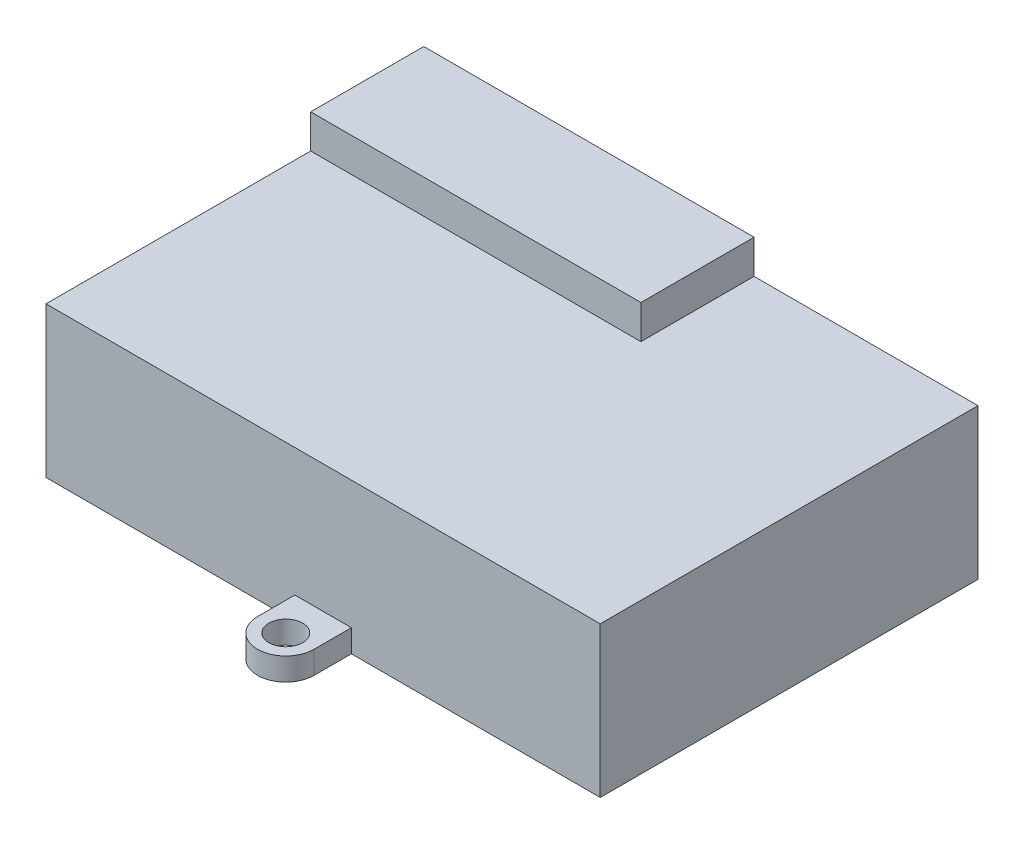
ISO-10303-21;
HEADER;
FILE_DESCRIPTION(('STEP AP214'),'2;1');
FILE_NAME('part.step','',(''),(''),'','','');
FILE_SCHEMA(('AUTOMOTIVE_DESIGN { 1 0 10303 214 1 1 1 1 }'));
ENDSEC;
DATA;
#1=APPLICATION_CONTEXT('core data for automotive mechanical design processes');
#2=APPLICATION_PROTOCOL_DEFINITION('international standard','automotive_design',2000,#1);
#3=PRODUCT_CONTEXT('',#1,'mechanical');
#4=PRODUCT('Part','Part','',(#3));
#5=PRODUCT_RELATED_PRODUCT_CATEGORY('part','',(#4));
#6=PRODUCT_DEFINITION_FORMATION('','',#4);
#7=PRODUCT_DEFINITION_CONTEXT('part definition',#1,'design');
#8=PRODUCT_DEFINITION('design','',#6,#7);
#9=PRODUCT_DEFINITION_SHAPE('','',#8);
#10=(LENGTH_UNIT() NAMED_UNIT(*) SI_UNIT(.MILLI.,.METRE.));
#11=(NAMED_UNIT(*) PLANE_ANGLE_UNIT() SI_UNIT($,.RADIAN.));
#12=(NAMED_UNIT(*) SI_UNIT($,.STERADIAN.) SOLID_ANGLE_UNIT());
#13=UNCERTAINTY_MEASURE_WITH_UNIT(LENGTH_MEASURE(1.E-05),#10,'distance_accuracy_value','');
#14=(GEOMETRIC_REPRESENTATION_CONTEXT(3) GLOBAL_UNCERTAINTY_ASSIGNED_CONTEXT((#13)) GLOBAL_UNIT_ASSIGNED_CONTEXT((#10,
#11,#12)) REPRESENTATION_CONTEXT('',''));
#15=CARTESIAN_POINT('',(0.,0.,0.));
#16=DIRECTION('',(0.,0.,1.));
#17=DIRECTION('',(1.,0.,0.));
#18=AXIS2_PLACEMENT_3D('',#15,#16,#17);
#19=CARTESIAN_POINT('',(0.,13.3,0.));
#20=DIRECTION('',(0.,1.,0.));
#21=DIRECTION('',(0.,0.,1.));
#22=AXIS2_PLACEMENT_3D('',#19,#20,#21);
#23=PLANE('',#22);
#24=DIRECTION('',(0.,0.,1.));
#25=VECTOR('',#24,1.);
#26=CARTESIAN_POINT('',(4.7,13.3,0.));
#27=LINE('',#26,#25);
#28=CARTESIAN_POINT('',(4.7,13.3,-16.7));
#29=VERTEX_POINT('',#28);
#30=CARTESIAN_POINT('',(4.7,13.3,-6.7));
#31=VERTEX_POINT('',#30);
#32=EDGE_CURVE('E180',#29,#31,#27,.T.);
#33=ORIENTED_EDGE('',*,*,#32,.T.);
#34=DIRECTION('',(-1.,0.,0.));
#35=VECTOR('',#34,1.);
#36=CARTESIAN_POINT('',(0.,13.3,-6.7));
#37=LINE('',#36,#35);
#38=CARTESIAN_POINT('',(-24.5,13.3,-6.7));
#39=VERTEX_POINT('',#38);
#40=EDGE_CURVE('E185',#31,#39,#37,.T.);
#41=ORIENTED_EDGE('',*,*,#40,.T.);
#42=DIRECTION('',(0.,0.,1.));
#43=VECTOR('',#42,1.);
#44=CARTESIAN_POINT('',(-24.5,13.3,0.));
#45=LINE('',#44,#43);
#46=CARTESIAN_POINT('',(-24.5,13.3,16.7));
#47=VERTEX_POINT('',#46);
#48=EDGE_CURVE('E178',#39,#47,#45,.T.);
#49=ORIENTED_EDGE('',*,*,#48,.T.);
#50=DIRECTION('',(1.,0.,0.));
#51=VECTOR('',#50,1.);
#52=CARTESIAN_POINT('',(0.,13.3,16.7));
#53=LINE('',#52,#51);
#54=CARTESIAN_POINT('',(24.5,13.3,16.7));
#55=VERTEX_POINT('',#54);
#56=EDGE_CURVE('E284',#47,#55,#53,.T.);
#57=ORIENTED_EDGE('',*,*,#56,.T.);
#58=DIRECTION('',(0.,0.,1.));
#59=VECTOR('',#58,1.);
#60=CARTESIAN_POINT('',(24.5,13.3,0.));
#61=LINE('',#60,#59);
#62=CARTESIAN_POINT('',(24.5,13.3,-16.7));
#63=VERTEX_POINT('',#62);
#64=EDGE_CURVE('E287',#63,#55,#61,.T.);
#65=ORIENTED_EDGE('',*,*,#64,.F.);
#66=DIRECTION('',(1.,0.,0.));
#67=VECTOR('',#66,1.);
#68=CARTESIAN_POINT('',(0.,13.3,-16.7));
#69=LINE('',#68,#67);
#70=EDGE_CURVE('E292',#29,#63,#69,.T.);
#71=ORIENTED_EDGE('',*,*,#70,.F.);
#72=EDGE_LOOP('',(#33,#41,#49,#57,#65,#71));
#73=FACE_BOUND('',#72,.T.);
#74=ADVANCED_FACE('F45',(#73),#23,.T.);
#75=CARTESIAN_POINT('',(0.,13.3,16.7));
#76=DIRECTION('',(0.,0.,-1.));
#77=DIRECTION('',(-1.,0.,0.));
#78=AXIS2_PLACEMENT_3D('',#75,#76,#77);
#79=PLANE('',#78);
#80=DIRECTION('',(0.,-1.,0.));
#81=VECTOR('',#80,1.);
#82=CARTESIAN_POINT('',(-2.5,2.,16.7));
#83=LINE('',#82,#81);
#84=CARTESIAN_POINT('',(-2.5,2.,16.7));
#85=VERTEX_POINT('',#84);
#86=CARTESIAN_POINT('',(-2.5,0.,16.7));
#87=VERTEX_POINT('',#86);
#88=EDGE_CURVE('E211',#85,#87,#83,.T.);
#89=ORIENTED_EDGE('',*,*,#88,.F.);
#90=DIRECTION('',(1.,0.,0.));
#91=VECTOR('',#90,1.);
#92=CARTESIAN_POINT('',(0.,2.,16.7));
#93=LINE('',#92,#91);
#94=CARTESIAN_POINT('',(2.5,2.,16.7));
#95=VERTEX_POINT('',#94);
#96=EDGE_CURVE('E207',#85,#95,#93,.T.);
#97=ORIENTED_EDGE('',*,*,#96,.T.);
#98=DIRECTION('',(0.,-1.,0.));
#99=VECTOR('',#98,1.);
#100=CARTESIAN_POINT('',(2.5,2.,16.7));
#101=LINE('',#100,#99);
#102=CARTESIAN_POINT('',(2.5,0.,16.7));
#103=VERTEX_POINT('',#102);
#104=EDGE_CURVE('E229',#95,#103,#101,.T.);
#105=ORIENTED_EDGE('',*,*,#104,.T.);
#106=DIRECTION('',(1.,0.,0.));
#107=VECTOR('',#106,1.);
#108=CARTESIAN_POINT('',(0.,0.,16.7));
#109=LINE('',#108,#107);
#110=CARTESIAN_POINT('',(24.5,0.,16.7));
#111=VERTEX_POINT('',#110);
#112=EDGE_CURVE('E238',#103,#111,#109,.T.);
#113=ORIENTED_EDGE('',*,*,#112,.T.);
#114=DIRECTION('',(0.,-1.,0.));
#115=VECTOR('',#114,1.);
#116=CARTESIAN_POINT('',(24.5,13.3,16.7));
#117=LINE('',#116,#115);
#118=EDGE_CURVE('E11',#55,#111,#117,.T.);
#119=ORIENTED_EDGE('',*,*,#118,.F.);
#120=ORIENTED_EDGE('',*,*,#56,.F.);
#121=DIRECTION('',(0.,-1.,0.));
#122=VECTOR('',#121,1.);
#123=CARTESIAN_POINT('',(-24.5,13.3,16.7));
#124=LINE('',#123,#122);
#125=CARTESIAN_POINT('',(-24.5,0.,16.7));
#126=VERTEX_POINT('',#125);
#127=EDGE_CURVE('E297',#47,#126,#124,.T.);
#128=ORIENTED_EDGE('',*,*,#127,.T.);
#129=EDGE_CURVE('E298',#126,#87,#109,.T.);
#130=ORIENTED_EDGE('',*,*,#129,.T.);
#131=EDGE_LOOP('',(#89,#97,#105,#113,#119,#120,#128,#130));
#132=FACE_BOUND('',#131,.T.);
#133=ADVANCED_FACE('F47',(#132),#79,.F.);
#134=CARTESIAN_POINT('',(24.5,13.3,0.));
#135=DIRECTION('',(1.,0.,0.));
#136=DIRECTION('',(0.,0.,-1.));
#137=AXIS2_PLACEMENT_3D('',#134,#135,#136);
#138=PLANE('',#137);
#139=DIRECTION('',(0.,0.,1.));
#140=VECTOR('',#139,1.);
#141=CARTESIAN_POINT('',(24.5,0.,0.));
#142=LINE('',#141,#140);
#143=CARTESIAN_POINT('',(24.5,0.,-16.7));
#144=VERTEX_POINT('',#143);
#145=EDGE_CURVE('E302',#144,#111,#142,.T.);
#146=ORIENTED_EDGE('',*,*,#145,.F.);
#147=DIRECTION('',(0.,-1.,0.));
#148=VECTOR('',#147,1.);
#149=CARTESIAN_POINT('',(24.5,13.3,-16.7));
#150=LINE('',#149,#148);
#151=EDGE_CURVE('E54',#63,#144,#150,.T.);
#152=ORIENTED_EDGE('',*,*,#151,.F.);
#153=ORIENTED_EDGE('',*,*,#64,.T.);
#154=ORIENTED_EDGE('',*,*,#118,.T.);
#155=EDGE_LOOP('',(#146,#152,#153,#154));
#156=FACE_BOUND('',#155,.T.);
#157=ADVANCED_FACE('F328',(#156),#138,.T.);
#158=CARTESIAN_POINT('',(0.,13.3,-16.7));
#159=DIRECTION('',(0.,0.,-1.));
#160=DIRECTION('',(-1.,0.,0.));
#161=AXIS2_PLACEMENT_3D('',#158,#159,#160);
#162=PLANE('',#161);
#163=DIRECTION('',(0.,-1.,0.));
#164=VECTOR('',#163,1.);
#165=CARTESIAN_POINT('',(4.7,16.3,-16.7));
#166=LINE('',#165,#164);
#167=CARTESIAN_POINT('',(4.7,16.3,-16.7));
#168=VERTEX_POINT('',#167);
#169=EDGE_CURVE('E61',#168,#29,#166,.T.);
#170=ORIENTED_EDGE('',*,*,#169,.T.);
#171=ORIENTED_EDGE('',*,*,#70,.T.);
#172=ORIENTED_EDGE('',*,*,#151,.T.);
#173=DIRECTION('',(1.,0.,0.));
#174=VECTOR('',#173,1.);
#175=CARTESIAN_POINT('',(0.,0.,-16.7));
#176=LINE('',#175,#174);
#177=CARTESIAN_POINT('',(2.49999999999999,0.,-16.7));
#178=VERTEX_POINT('',#177);
#179=EDGE_CURVE('E306',#178,#144,#176,.T.);
#180=ORIENTED_EDGE('',*,*,#179,.F.);
#181=DIRECTION('',(0.,-1.,0.));
#182=VECTOR('',#181,1.);
#183=CARTESIAN_POINT('',(2.49999999999999,2.,-16.7));
#184=LINE('',#183,#182);
#185=CARTESIAN_POINT('',(2.49999999999999,2.,-16.7));
#186=VERTEX_POINT('',#185);
#187=EDGE_CURVE('E258',#186,#178,#184,.T.);
#188=ORIENTED_EDGE('',*,*,#187,.F.);
#189=DIRECTION('',(1.,0.,0.));
#190=VECTOR('',#189,1.);
#191=CARTESIAN_POINT('',(0.,2.,-16.7));
#192=LINE('',#191,#190);
#193=CARTESIAN_POINT('',(-2.50000000000001,2.,-16.7));
#194=VERTEX_POINT('',#193);
#195=EDGE_CURVE('E255',#194,#186,#192,.T.);
#196=ORIENTED_EDGE('',*,*,#195,.F.);
#197=DIRECTION('',(0.,-1.,0.));
#198=VECTOR('',#197,1.);
#199=CARTESIAN_POINT('',(-2.50000000000001,2.,-16.7));
#200=LINE('',#199,#198);
#201=CARTESIAN_POINT('',(-2.50000000000001,0.,-16.7));
#202=VERTEX_POINT('',#201);
#203=EDGE_CURVE('E274',#194,#202,#200,.T.);
#204=ORIENTED_EDGE('',*,*,#203,.T.);
#205=CARTESIAN_POINT('',(-24.5,0.,-16.7));
#206=VERTEX_POINT('',#205);
#207=EDGE_CURVE('E307',#206,#202,#176,.T.);
#208=ORIENTED_EDGE('',*,*,#207,.F.);
#209=DIRECTION('',(0.,-1.,0.));
#210=VECTOR('',#209,1.);
#211=CARTESIAN_POINT('',(-24.5,13.3,-16.7));
#212=LINE('',#211,#210);
#213=CARTESIAN_POINT('',(-24.5,16.3,-16.7));
#214=VERTEX_POINT('',#213);
#215=EDGE_CURVE('E316',#214,#206,#212,.T.);
#216=ORIENTED_EDGE('',*,*,#215,.F.);
#217=DIRECTION('',(-1.,0.,0.));
#218=VECTOR('',#217,1.);
#219=CARTESIAN_POINT('',(-24.5,16.3,-16.7));
#220=LINE('',#219,#218);
#221=EDGE_CURVE('E171',#168,#214,#220,.T.);
#222=ORIENTED_EDGE('',*,*,#221,.F.);
#223=EDGE_LOOP('',(#170,#171,#172,#180,#188,#196,#204,#208,#216,#222));
#224=FACE_BOUND('',#223,.T.);
#225=ADVANCED_FACE('F323',(#224),#162,.T.);
#226=CARTESIAN_POINT('',(-24.5,13.3,0.));
#227=DIRECTION('',(1.,0.,0.));
#228=DIRECTION('',(0.,0.,-1.));
#229=AXIS2_PLACEMENT_3D('',#226,#227,#228);
#230=PLANE('',#229);
#231=DIRECTION('',(0.,0.,1.));
#232=VECTOR('',#231,1.);
#233=CARTESIAN_POINT('',(-24.5,0.,0.));
#234=LINE('',#233,#232);
#235=EDGE_CURVE('E288',#206,#126,#234,.T.);
#236=ORIENTED_EDGE('',*,*,#235,.T.);
#237=ORIENTED_EDGE('',*,*,#127,.F.);
#238=ORIENTED_EDGE('',*,*,#48,.F.);
#239=DIRECTION('',(0.,-1.,0.));
#240=VECTOR('',#239,1.);
#241=CARTESIAN_POINT('',(-24.5,16.3,-6.7));
#242=LINE('',#241,#240);
#243=CARTESIAN_POINT('',(-24.5,16.3,-6.7));
#244=VERTEX_POINT('',#243);
#245=EDGE_CURVE('E158',#244,#39,#242,.T.);
#246=ORIENTED_EDGE('',*,*,#245,.F.);
#247=DIRECTION('',(0.,0.,1.));
#248=VECTOR('',#247,1.);
#249=CARTESIAN_POINT('',(-24.5,16.3,-16.7));
#250=LINE('',#249,#248);
#251=EDGE_CURVE('E166',#214,#244,#250,.T.);
#252=ORIENTED_EDGE('',*,*,#251,.F.);
#253=ORIENTED_EDGE('',*,*,#215,.T.);
#254=EDGE_LOOP('',(#236,#237,#238,#246,#252,#253));
#255=FACE_BOUND('',#254,.T.);
#256=ADVANCED_FACE('F176',(#255),#230,.F.);
#257=CARTESIAN_POINT('',(0.,0.,0.));
#258=DIRECTION('',(0.,1.,0.));
#259=DIRECTION('',(0.,0.,1.));
#260=AXIS2_PLACEMENT_3D('',#257,#258,#259);
#261=PLANE('',#260);
#262=ORIENTED_EDGE('',*,*,#129,.F.);
#263=ORIENTED_EDGE('',*,*,#235,.F.);
#264=ORIENTED_EDGE('',*,*,#207,.T.);
#265=DIRECTION('',(0.,0.,1.));
#266=VECTOR('',#265,1.);
#267=CARTESIAN_POINT('',(-2.49999999999999,0.,0.));
#268=LINE('',#267,#266);
#269=CARTESIAN_POINT('',(-2.50000000000001,0.,-20.));
#270=VERTEX_POINT('',#269);
#271=EDGE_CURVE('E244',#270,#202,#268,.T.);
#272=ORIENTED_EDGE('',*,*,#271,.F.);
#273=CARTESIAN_POINT('',(0.,0.,-20.));
#274=DIRECTION('',(0.,1.,0.));
#275=DIRECTION('',(0.,0.,1.));
#276=AXIS2_PLACEMENT_3D('',#273,#274,#275);
#277=CIRCLE('',#276,2.5);
#278=CARTESIAN_POINT('',(2.49999999999999,0.,-20.));
#279=VERTEX_POINT('',#278);
#280=EDGE_CURVE('E266',#279,#270,#277,.T.);
#281=ORIENTED_EDGE('',*,*,#280,.F.);
#282=DIRECTION('',(0.,0.,1.));
#283=VECTOR('',#282,1.);
#284=CARTESIAN_POINT('',(2.50000000000003,0.,0.));
#285=LINE('',#284,#283);
#286=EDGE_CURVE('E262',#279,#178,#285,.T.);
#287=ORIENTED_EDGE('',*,*,#286,.T.);
#288=ORIENTED_EDGE('',*,*,#179,.T.);
#289=ORIENTED_EDGE('',*,*,#145,.T.);
#290=ORIENTED_EDGE('',*,*,#112,.F.);
#291=DIRECTION('',(0.,0.,-1.));
#292=VECTOR('',#291,1.);
#293=CARTESIAN_POINT('',(2.5,0.,0.));
#294=LINE('',#293,#292);
#295=CARTESIAN_POINT('',(2.5,0.,20.));
#296=VERTEX_POINT('',#295);
#297=EDGE_CURVE('E69',#296,#103,#294,.T.);
#298=ORIENTED_EDGE('',*,*,#297,.F.);
#299=CARTESIAN_POINT('',(0.,0.,20.));
#300=DIRECTION('',(0.,1.,0.));
#301=DIRECTION('',(0.,0.,1.));
#302=AXIS2_PLACEMENT_3D('',#299,#300,#301);
#303=CIRCLE('',#302,2.5);
#304=CARTESIAN_POINT('',(-2.5,0.,20.));
#305=VERTEX_POINT('',#304);
#306=EDGE_CURVE('E221',#305,#296,#303,.T.);
#307=ORIENTED_EDGE('',*,*,#306,.F.);
#308=DIRECTION('',(0.,0.,-1.));
#309=VECTOR('',#308,1.);
#310=CARTESIAN_POINT('',(-2.5,0.,0.));
#311=LINE('',#310,#309);
#312=EDGE_CURVE('E216',#305,#87,#311,.T.);
#313=ORIENTED_EDGE('',*,*,#312,.T.);
#314=EDGE_LOOP('',(#262,#263,#264,#272,#281,#287,#288,#289,#290,#298,#307,#313));
#315=FACE_BOUND('',#314,.T.);
#316=CARTESIAN_POINT('',(0.,0.,-20.));
#317=DIRECTION('',(0.,1.,0.));
#318=DIRECTION('',(0.,0.,1.));
#319=AXIS2_PLACEMENT_3D('',#316,#317,#318);
#320=CIRCLE('',#319,1.5);
#321=CARTESIAN_POINT('',(0.,0.,-18.5));
#322=VERTEX_POINT('',#321);
#323=EDGE_CURVE('E192',#322,#322,#320,.T.);
#324=ORIENTED_EDGE('',*,*,#323,.T.);
#325=EDGE_LOOP('',(#324));
#326=FACE_BOUND('',#325,.T.);
#327=CARTESIAN_POINT('',(0.,0.,20.));
#328=DIRECTION('',(0.,1.,0.));
#329=DIRECTION('',(0.,0.,1.));
#330=AXIS2_PLACEMENT_3D('',#327,#328,#329);
#331=CIRCLE('',#330,1.5);
#332=CARTESIAN_POINT('',(0.,0.,21.5));
#333=VERTEX_POINT('',#332);
#334=EDGE_CURVE('E212',#333,#333,#331,.T.);
#335=ORIENTED_EDGE('',*,*,#334,.T.);
#336=EDGE_LOOP('',(#335));
#337=FACE_BOUND('',#336,.T.);
#338=ADVANCED_FACE('F333',(#315,#326,#337),#261,.F.);
#339=CARTESIAN_POINT('',(2.50000000000003,2.,0.));
#340=DIRECTION('',(1.,0.,0.));
#341=DIRECTION('',(0.,0.,-1.));
#342=AXIS2_PLACEMENT_3D('',#339,#340,#341);
#343=PLANE('',#342);
#344=ORIENTED_EDGE('',*,*,#286,.F.);
#345=DIRECTION('',(0.,-1.,0.));
#346=VECTOR('',#345,1.);
#347=CARTESIAN_POINT('',(2.49999999999999,2.,-20.));
#348=LINE('',#347,#346);
#349=CARTESIAN_POINT('',(2.49999999999999,2.,-20.));
#350=VERTEX_POINT('',#349);
#351=EDGE_CURVE('E217',#350,#279,#348,.T.);
#352=ORIENTED_EDGE('',*,*,#351,.F.);
#353=DIRECTION('',(0.,0.,1.));
#354=VECTOR('',#353,1.);
#355=CARTESIAN_POINT('',(2.50000000000003,2.,0.));
#356=LINE('',#355,#354);
#357=EDGE_CURVE('E243',#350,#186,#356,.T.);
#358=ORIENTED_EDGE('',*,*,#357,.T.);
#359=ORIENTED_EDGE('',*,*,#187,.T.);
#360=EDGE_LOOP('',(#344,#352,#358,#359));
#361=FACE_BOUND('',#360,.T.);
#362=ADVANCED_FACE('F364',(#361),#343,.T.);
#363=CARTESIAN_POINT('',(0.,2.,-20.));
#364=DIRECTION('',(0.,-1.,0.));
#365=DIRECTION('',(0.,0.,-1.));
#366=AXIS2_PLACEMENT_3D('',#363,#364,#365);
#367=CYLINDRICAL_SURFACE('',#366,2.5);
#368=ORIENTED_EDGE('',*,*,#280,.T.);
#369=DIRECTION('',(0.,-1.,0.));
#370=VECTOR('',#369,1.);
#371=CARTESIAN_POINT('',(-2.50000000000001,2.,-20.));
#372=LINE('',#371,#370);
#373=CARTESIAN_POINT('',(-2.50000000000001,2.,-20.));
#374=VERTEX_POINT('',#373);
#375=EDGE_CURVE('E278',#374,#270,#372,.T.);
#376=ORIENTED_EDGE('',*,*,#375,.F.);
#377=CARTESIAN_POINT('',(0.,2.,-20.));
#378=DIRECTION('',(0.,1.,0.));
#379=DIRECTION('',(0.,0.,1.));
#380=AXIS2_PLACEMENT_3D('',#377,#378,#379);
#381=CIRCLE('',#380,2.5);
#382=EDGE_CURVE('E248',#350,#374,#381,.T.);
#383=ORIENTED_EDGE('',*,*,#382,.F.);
#384=ORIENTED_EDGE('',*,*,#351,.T.);
#385=EDGE_LOOP('',(#368,#376,#383,#384));
#386=FACE_BOUND('',#385,.T.);
#387=ADVANCED_FACE('F369',(#386),#367,.T.);
#388=CARTESIAN_POINT('',(-2.49999999999999,2.,0.));
#389=DIRECTION('',(1.,0.,0.));
#390=DIRECTION('',(0.,0.,-1.));
#391=AXIS2_PLACEMENT_3D('',#388,#389,#390);
#392=PLANE('',#391);
#393=ORIENTED_EDGE('',*,*,#271,.T.);
#394=ORIENTED_EDGE('',*,*,#203,.F.);
#395=DIRECTION('',(0.,0.,1.));
#396=VECTOR('',#395,1.);
#397=CARTESIAN_POINT('',(-2.49999999999999,2.,0.));
#398=LINE('',#397,#396);
#399=EDGE_CURVE('E252',#374,#194,#398,.T.);
#400=ORIENTED_EDGE('',*,*,#399,.F.);
#401=ORIENTED_EDGE('',*,*,#375,.T.);
#402=EDGE_LOOP('',(#393,#394,#400,#401));
#403=FACE_BOUND('',#402,.T.);
#404=ADVANCED_FACE('F360',(#403),#392,.F.);
#405=CARTESIAN_POINT('',(0.,2.,-20.));
#406=DIRECTION('',(0.,-1.,0.));
#407=DIRECTION('',(0.,0.,-1.));
#408=AXIS2_PLACEMENT_3D('',#405,#406,#407);
#409=CYLINDRICAL_SURFACE('',#408,1.5);
#410=CARTESIAN_POINT('',(0.,2.,-20.));
#411=DIRECTION('',(0.,1.,0.));
#412=DIRECTION('',(0.,0.,1.));
#413=AXIS2_PLACEMENT_3D('',#410,#411,#412);
#414=CIRCLE('',#413,1.5);
#415=CARTESIAN_POINT('',(0.,2.,-18.5));
#416=VERTEX_POINT('',#415);
#417=EDGE_CURVE('E239',#416,#416,#414,.T.);
#418=ORIENTED_EDGE('',*,*,#417,.T.);
#419=EDGE_LOOP('',(#418));
#420=FACE_BOUND('',#419,.T.);
#421=ORIENTED_EDGE('',*,*,#323,.F.);
#422=EDGE_LOOP('',(#421));
#423=FACE_BOUND('',#422,.T.);
#424=ADVANCED_FACE('F376',(#420,#423),#409,.F.);
#425=CARTESIAN_POINT('',(0.,2.,0.));
#426=DIRECTION('',(0.,1.,0.));
#427=DIRECTION('',(0.,0.,1.));
#428=AXIS2_PLACEMENT_3D('',#425,#426,#427);
#429=PLANE('',#428);
#430=ORIENTED_EDGE('',*,*,#417,.F.);
#431=EDGE_LOOP('',(#430));
#432=FACE_BOUND('',#431,.T.);
#433=ORIENTED_EDGE('',*,*,#357,.F.);
#434=ORIENTED_EDGE('',*,*,#382,.T.);
#435=ORIENTED_EDGE('',*,*,#399,.T.);
#436=ORIENTED_EDGE('',*,*,#195,.T.);
#437=EDGE_LOOP('',(#433,#434,#435,#436));
#438=FACE_BOUND('',#437,.T.);
#439=ADVANCED_FACE('F368',(#432,#438),#429,.T.);
#440=CARTESIAN_POINT('',(-2.5,2.,0.));
#441=DIRECTION('',(-1.,0.,0.));
#442=DIRECTION('',(0.,0.,1.));
#443=AXIS2_PLACEMENT_3D('',#440,#441,#442);
#444=PLANE('',#443);
#445=ORIENTED_EDGE('',*,*,#312,.F.);
#446=DIRECTION('',(0.,-1.,0.));
#447=VECTOR('',#446,1.);
#448=CARTESIAN_POINT('',(-2.5,2.,20.));
#449=LINE('',#448,#447);
#450=CARTESIAN_POINT('',(-2.5,2.,20.));
#451=VERTEX_POINT('',#450);
#452=EDGE_CURVE('E235',#451,#305,#449,.T.);
#453=ORIENTED_EDGE('',*,*,#452,.F.);
#454=DIRECTION('',(0.,0.,-1.));
#455=VECTOR('',#454,1.);
#456=CARTESIAN_POINT('',(-2.5,2.,0.));
#457=LINE('',#456,#455);
#458=EDGE_CURVE('E197',#451,#85,#457,.T.);
#459=ORIENTED_EDGE('',*,*,#458,.T.);
#460=ORIENTED_EDGE('',*,*,#88,.T.);
#461=EDGE_LOOP('',(#445,#453,#459,#460));
#462=FACE_BOUND('',#461,.T.);
#463=ADVANCED_FACE('F354',(#462),#444,.T.);
#464=CARTESIAN_POINT('',(0.,2.,20.));
#465=DIRECTION('',(0.,-1.,0.));
#466=DIRECTION('',(0.,0.,-1.));
#467=AXIS2_PLACEMENT_3D('',#464,#465,#466);
#468=CYLINDRICAL_SURFACE('',#467,2.5);
#469=ORIENTED_EDGE('',*,*,#306,.T.);
#470=DIRECTION('',(0.,-1.,0.));
#471=VECTOR('',#470,1.);
#472=CARTESIAN_POINT('',(2.5,2.,20.));
#473=LINE('',#472,#471);
#474=CARTESIAN_POINT('',(2.5,2.,20.));
#475=VERTEX_POINT('',#474);
#476=EDGE_CURVE('E232',#475,#296,#473,.T.);
#477=ORIENTED_EDGE('',*,*,#476,.F.);
#478=CARTESIAN_POINT('',(0.,2.,20.));
#479=DIRECTION('',(0.,1.,0.));
#480=DIRECTION('',(0.,0.,1.));
#481=AXIS2_PLACEMENT_3D('',#478,#479,#480);
#482=CIRCLE('',#481,2.5);
#483=EDGE_CURVE('E200',#451,#475,#482,.T.);
#484=ORIENTED_EDGE('',*,*,#483,.F.);
#485=ORIENTED_EDGE('',*,*,#452,.T.);
#486=EDGE_LOOP('',(#469,#477,#484,#485));
#487=FACE_BOUND('',#486,.T.);
#488=ADVANCED_FACE('F350',(#487),#468,.T.);
#489=CARTESIAN_POINT('',(2.5,2.,0.));
#490=DIRECTION('',(-1.,0.,0.));
#491=DIRECTION('',(0.,0.,1.));
#492=AXIS2_PLACEMENT_3D('',#489,#490,#491);
#493=PLANE('',#492);
#494=ORIENTED_EDGE('',*,*,#297,.T.);
#495=ORIENTED_EDGE('',*,*,#104,.F.);
#496=DIRECTION('',(0.,0.,-1.));
#497=VECTOR('',#496,1.);
#498=CARTESIAN_POINT('',(2.5,2.,0.));
#499=LINE('',#498,#497);
#500=EDGE_CURVE('E204',#475,#95,#499,.T.);
#501=ORIENTED_EDGE('',*,*,#500,.F.);
#502=ORIENTED_EDGE('',*,*,#476,.T.);
#503=EDGE_LOOP('',(#494,#495,#501,#502));
#504=FACE_BOUND('',#503,.T.);
#505=ADVANCED_FACE('F343',(#504),#493,.F.);
#506=CARTESIAN_POINT('',(0.,2.,20.));
#507=DIRECTION('',(0.,-1.,0.));
#508=DIRECTION('',(0.,0.,-1.));
#509=AXIS2_PLACEMENT_3D('',#506,#507,#508);
#510=CYLINDRICAL_SURFACE('',#509,1.5);
#511=CARTESIAN_POINT('',(0.,2.,20.));
#512=DIRECTION('',(0.,1.,0.));
#513=DIRECTION('',(0.,0.,1.));
#514=AXIS2_PLACEMENT_3D('',#511,#512,#513);
#515=CIRCLE('',#514,1.5);
#516=CARTESIAN_POINT('',(0.,2.,21.5));
#517=VERTEX_POINT('',#516);
#518=EDGE_CURVE('E193',#517,#517,#515,.T.);
#519=ORIENTED_EDGE('',*,*,#518,.T.);
#520=EDGE_LOOP('',(#519));
#521=FACE_BOUND('',#520,.T.);
#522=ORIENTED_EDGE('',*,*,#334,.F.);
#523=EDGE_LOOP('',(#522));
#524=FACE_BOUND('',#523,.T.);
#525=ADVANCED_FACE('F464',(#521,#524),#510,.F.);
#526=CARTESIAN_POINT('',(0.,2.,0.));
#527=DIRECTION('',(0.,1.,0.));
#528=DIRECTION('',(0.,0.,1.));
#529=AXIS2_PLACEMENT_3D('',#526,#527,#528);
#530=PLANE('',#529);
#531=ORIENTED_EDGE('',*,*,#518,.F.);
#532=EDGE_LOOP('',(#531));
#533=FACE_BOUND('',#532,.T.);
#534=ORIENTED_EDGE('',*,*,#458,.F.);
#535=ORIENTED_EDGE('',*,*,#483,.T.);
#536=ORIENTED_EDGE('',*,*,#500,.T.);
#537=ORIENTED_EDGE('',*,*,#96,.F.);
#538=EDGE_LOOP('',(#534,#535,#536,#537));
#539=FACE_BOUND('',#538,.T.);
#540=ADVANCED_FACE('F348',(#533,#539),#530,.T.);
#541=CARTESIAN_POINT('',(-24.5,16.3,-6.7));
#542=DIRECTION('',(0.,0.,-1.));
#543=DIRECTION('',(-1.,0.,0.));
#544=AXIS2_PLACEMENT_3D('',#541,#542,#543);
#545=PLANE('',#544);
#546=ORIENTED_EDGE('',*,*,#40,.F.);
#547=DIRECTION('',(0.,-1.,0.));
#548=VECTOR('',#547,1.);
#549=CARTESIAN_POINT('',(4.7,16.3,-6.7));
#550=LINE('',#549,#548);
#551=CARTESIAN_POINT('',(4.7,16.3,-6.7));
#552=VERTEX_POINT('',#551);
#553=EDGE_CURVE('E161',#552,#31,#550,.T.);
#554=ORIENTED_EDGE('',*,*,#553,.F.);
#555=DIRECTION('',(1.,0.,0.));
#556=VECTOR('',#555,1.);
#557=CARTESIAN_POINT('',(-24.5,16.3,-6.7));
#558=LINE('',#557,#556);
#559=EDGE_CURVE('E154',#244,#552,#558,.T.);
#560=ORIENTED_EDGE('',*,*,#559,.F.);
#561=ORIENTED_EDGE('',*,*,#245,.T.);
#562=EDGE_LOOP('',(#546,#554,#560,#561));
#563=FACE_BOUND('',#562,.T.);
#564=ADVANCED_FACE('F156',(#563),#545,.F.);
#565=CARTESIAN_POINT('',(4.7,16.3,-16.7));
#566=DIRECTION('',(-1.,0.,0.));
#567=DIRECTION('',(0.,0.,1.));
#568=AXIS2_PLACEMENT_3D('',#565,#566,#567);
#569=PLANE('',#568);
#570=ORIENTED_EDGE('',*,*,#32,.F.);
#571=ORIENTED_EDGE('',*,*,#169,.F.);
#572=DIRECTION('',(0.,0.,-1.));
#573=VECTOR('',#572,1.);
#574=CARTESIAN_POINT('',(4.7,16.3,-16.7));
#575=LINE('',#574,#573);
#576=EDGE_CURVE('E165',#552,#168,#575,.T.);
#577=ORIENTED_EDGE('',*,*,#576,.F.);
#578=ORIENTED_EDGE('',*,*,#553,.T.);
#579=EDGE_LOOP('',(#570,#571,#577,#578));
#580=FACE_BOUND('',#579,.T.);
#581=ADVANCED_FACE('F511',(#580),#569,.F.);
#582=CARTESIAN_POINT('',(0.,16.3,0.));
#583=DIRECTION('',(0.,1.,0.));
#584=DIRECTION('',(0.,0.,1.));
#585=AXIS2_PLACEMENT_3D('',#582,#583,#584);
#586=PLANE('',#585);
#587=ORIENTED_EDGE('',*,*,#251,.T.);
#588=ORIENTED_EDGE('',*,*,#559,.T.);
#589=ORIENTED_EDGE('',*,*,#576,.T.);
#590=ORIENTED_EDGE('',*,*,#221,.T.);
#591=EDGE_LOOP('',(#587,#588,#589,#590));
#592=FACE_BOUND('',#591,.T.);
#593=ADVANCED_FACE('F170',(#592),#586,.T.);
#594=CLOSED_SHELL('',(#74,#133,#157,#225,#256,#338,#362,#387,#404,#424,#439,#463,#488,#505,#525,
#540,#564,#581,#593));
#595=MANIFOLD_SOLID_BREP('B2',#594);
#596=ADVANCED_BREP_SHAPE_REPRESENTATION('',(#18,#595),#14);
#597=SHAPE_DEFINITION_REPRESENTATION(#9,#596);
ENDSEC;
END-ISO-10303-21;
